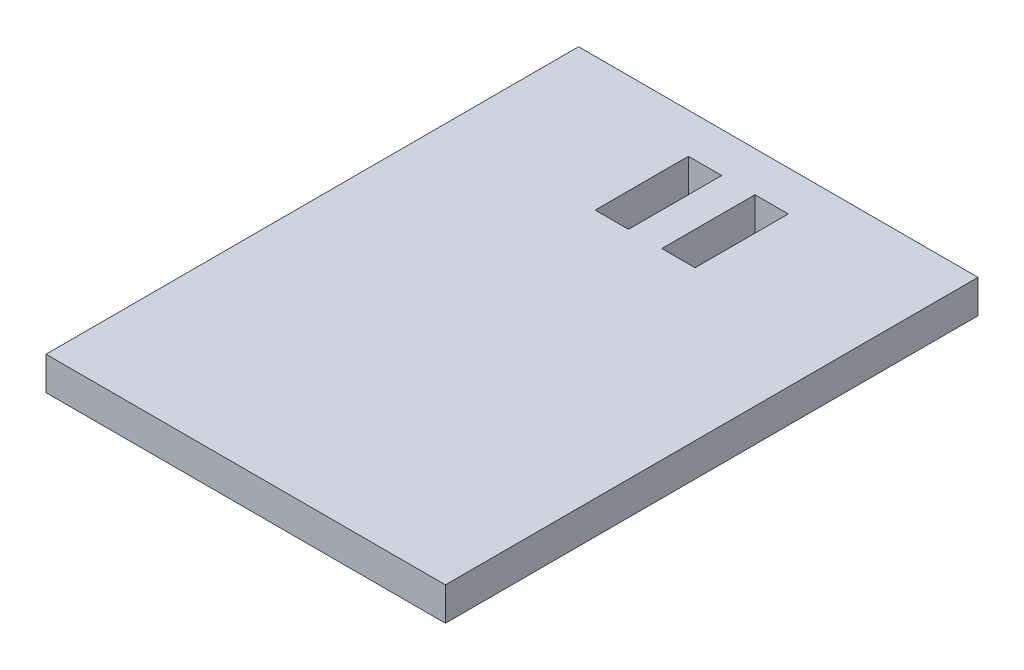
ISO-10303-21;
HEADER;
FILE_DESCRIPTION(('STEP AP214'),'2;1');
FILE_NAME('part.step','',(''),(''),'','','');
FILE_SCHEMA(('AUTOMOTIVE_DESIGN { 1 0 10303 214 1 1 1 1 }'));
ENDSEC;
DATA;
#1=APPLICATION_CONTEXT('core data for automotive mechanical design processes');
#2=APPLICATION_PROTOCOL_DEFINITION('international standard','automotive_design',2000,#1);
#3=PRODUCT_CONTEXT('',#1,'mechanical');
#4=PRODUCT('Part','Part','',(#3));
#5=PRODUCT_RELATED_PRODUCT_CATEGORY('part','',(#4));
#6=PRODUCT_DEFINITION_FORMATION('','',#4);
#7=PRODUCT_DEFINITION_CONTEXT('part definition',#1,'design');
#8=PRODUCT_DEFINITION('design','',#6,#7);
#9=PRODUCT_DEFINITION_SHAPE('','',#8);
#10=(LENGTH_UNIT() NAMED_UNIT(*) SI_UNIT(.MILLI.,.METRE.));
#11=(NAMED_UNIT(*) PLANE_ANGLE_UNIT() SI_UNIT($,.RADIAN.));
#12=(NAMED_UNIT(*) SI_UNIT($,.STERADIAN.) SOLID_ANGLE_UNIT());
#13=UNCERTAINTY_MEASURE_WITH_UNIT(LENGTH_MEASURE(1.E-05),#10,'distance_accuracy_value','');
#14=(GEOMETRIC_REPRESENTATION_CONTEXT(3) GLOBAL_UNCERTAINTY_ASSIGNED_CONTEXT((#13)) GLOBAL_UNIT_ASSIGNED_CONTEXT((#10,
#11,#12)) REPRESENTATION_CONTEXT('',''));
#15=CARTESIAN_POINT('',(0.,0.,0.));
#16=DIRECTION('',(0.,0.,1.));
#17=DIRECTION('',(1.,0.,0.));
#18=AXIS2_PLACEMENT_3D('',#15,#16,#17);
#19=CARTESIAN_POINT('',(0.,3.175,0.));
#20=DIRECTION('',(0.,-1.,0.));
#21=DIRECTION('',(0.,0.,-1.));
#22=AXIS2_PLACEMENT_3D('',#19,#20,#21);
#23=PLANE('',#22);
#24=DIRECTION('',(0.,0.,1.));
#25=VECTOR('',#24,1.);
#26=CARTESIAN_POINT('',(14.2875,3.175,-46.99));
#27=LINE('',#26,#25);
#28=CARTESIAN_POINT('',(14.2875,3.175,-46.99));
#29=VERTEX_POINT('',#28);
#30=CARTESIAN_POINT('',(14.2875,3.175,-38.1));
#31=VERTEX_POINT('',#30);
#32=EDGE_CURVE('E164',#29,#31,#27,.T.);
#33=ORIENTED_EDGE('',*,*,#32,.F.);
#34=DIRECTION('',(-1.,0.,0.));
#35=VECTOR('',#34,1.);
#36=CARTESIAN_POINT('',(14.2875,3.175,-46.99));
#37=LINE('',#36,#35);
#38=CARTESIAN_POINT('',(17.4625,3.175,-46.99));
#39=VERTEX_POINT('',#38);
#40=EDGE_CURVE('E172',#39,#29,#37,.T.);
#41=ORIENTED_EDGE('',*,*,#40,.F.);
#42=DIRECTION('',(0.,0.,-1.));
#43=VECTOR('',#42,1.);
#44=CARTESIAN_POINT('',(17.4625,3.175,-46.99));
#45=LINE('',#44,#43);
#46=CARTESIAN_POINT('',(17.4625,3.175,-38.1));
#47=VERTEX_POINT('',#46);
#48=EDGE_CURVE('E169',#47,#39,#45,.T.);
#49=ORIENTED_EDGE('',*,*,#48,.F.);
#50=DIRECTION('',(1.,0.,0.));
#51=VECTOR('',#50,1.);
#52=CARTESIAN_POINT('',(14.2875,3.175,-38.1));
#53=LINE('',#52,#51);
#54=EDGE_CURVE('E166',#31,#47,#53,.T.);
#55=ORIENTED_EDGE('',*,*,#54,.F.);
#56=EDGE_LOOP('',(#33,#41,#49,#55));
#57=FACE_BOUND('',#56,.T.);
#58=DIRECTION('',(0.,0.,1.));
#59=VECTOR('',#58,1.);
#60=CARTESIAN_POINT('',(0.,3.175,0.));
#61=LINE('',#60,#59);
#62=CARTESIAN_POINT('',(0.,3.175,-50.8));
#63=VERTEX_POINT('',#62);
#64=CARTESIAN_POINT('',(0.,3.175,0.));
#65=VERTEX_POINT('',#64);
#66=EDGE_CURVE('E195',#63,#65,#61,.T.);
#67=ORIENTED_EDGE('',*,*,#66,.T.);
#68=DIRECTION('',(1.,0.,0.));
#69=VECTOR('',#68,1.);
#70=CARTESIAN_POINT('',(0.,3.175,0.));
#71=LINE('',#70,#69);
#72=CARTESIAN_POINT('',(38.1,3.175,0.));
#73=VERTEX_POINT('',#72);
#74=EDGE_CURVE('E198',#65,#73,#71,.T.);
#75=ORIENTED_EDGE('',*,*,#74,.T.);
#76=DIRECTION('',(0.,0.,-1.));
#77=VECTOR('',#76,1.);
#78=CARTESIAN_POINT('',(38.1,3.175,0.));
#79=LINE('',#78,#77);
#80=CARTESIAN_POINT('',(38.1,3.175,-50.8));
#81=VERTEX_POINT('',#80);
#82=EDGE_CURVE('E201',#73,#81,#79,.T.);
#83=ORIENTED_EDGE('',*,*,#82,.T.);
#84=DIRECTION('',(-1.,0.,0.));
#85=VECTOR('',#84,1.);
#86=CARTESIAN_POINT('',(0.,3.175,-50.8));
#87=LINE('',#86,#85);
#88=EDGE_CURVE('E203',#81,#63,#87,.T.);
#89=ORIENTED_EDGE('',*,*,#88,.T.);
#90=EDGE_LOOP('',(#67,#75,#83,#89));
#91=FACE_BOUND('',#90,.T.);
#92=DIRECTION('',(0.,0.,1.));
#93=VECTOR('',#92,1.);
#94=CARTESIAN_POINT('',(20.6375,3.175,-46.99));
#95=LINE('',#94,#93);
#96=CARTESIAN_POINT('',(20.6375,3.175,-46.99));
#97=VERTEX_POINT('',#96);
#98=CARTESIAN_POINT('',(20.6375,3.175,-38.1));
#99=VERTEX_POINT('',#98);
#100=EDGE_CURVE('E128',#97,#99,#95,.T.);
#101=ORIENTED_EDGE('',*,*,#100,.F.);
#102=DIRECTION('',(-1.,0.,0.));
#103=VECTOR('',#102,1.);
#104=CARTESIAN_POINT('',(20.6375,3.175,-46.99));
#105=LINE('',#104,#103);
#106=CARTESIAN_POINT('',(23.8125,3.175,-46.99));
#107=VERTEX_POINT('',#106);
#108=EDGE_CURVE('E150',#107,#97,#105,.T.);
#109=ORIENTED_EDGE('',*,*,#108,.F.);
#110=DIRECTION('',(0.,0.,-1.));
#111=VECTOR('',#110,1.);
#112=CARTESIAN_POINT('',(23.8125,3.175,-46.99));
#113=LINE('',#112,#111);
#114=CARTESIAN_POINT('',(23.8125,3.175,-38.1));
#115=VERTEX_POINT('',#114);
#116=EDGE_CURVE('E148',#115,#107,#113,.T.);
#117=ORIENTED_EDGE('',*,*,#116,.F.);
#118=DIRECTION('',(1.,0.,0.));
#119=VECTOR('',#118,1.);
#120=CARTESIAN_POINT('',(20.6375,3.175,-38.1));
#121=LINE('',#120,#119);
#122=EDGE_CURVE('E136',#99,#115,#121,.T.);
#123=ORIENTED_EDGE('',*,*,#122,.F.);
#124=EDGE_LOOP('',(#101,#109,#117,#123));
#125=FACE_BOUND('',#124,.T.);
#126=ADVANCED_FACE('F39',(#57,#91,#125),#23,.F.);
#127=CARTESIAN_POINT('',(0.,0.,0.));
#128=DIRECTION('',(0.,-1.,0.));
#129=DIRECTION('',(0.,0.,-1.));
#130=AXIS2_PLACEMENT_3D('',#127,#128,#129);
#131=PLANE('',#130);
#132=DIRECTION('',(0.,0.,1.));
#133=VECTOR('',#132,1.);
#134=CARTESIAN_POINT('',(0.,0.,0.));
#135=LINE('',#134,#133);
#136=CARTESIAN_POINT('',(0.,0.,-50.8));
#137=VERTEX_POINT('',#136);
#138=CARTESIAN_POINT('',(0.,0.,0.));
#139=VERTEX_POINT('',#138);
#140=EDGE_CURVE('E194',#137,#139,#135,.T.);
#141=ORIENTED_EDGE('',*,*,#140,.F.);
#142=DIRECTION('',(-1.,0.,0.));
#143=VECTOR('',#142,1.);
#144=CARTESIAN_POINT('',(0.,0.,-50.8));
#145=LINE('',#144,#143);
#146=CARTESIAN_POINT('',(38.1,0.,-50.8));
#147=VERTEX_POINT('',#146);
#148=EDGE_CURVE('E199',#147,#137,#145,.T.);
#149=ORIENTED_EDGE('',*,*,#148,.F.);
#150=DIRECTION('',(0.,0.,-1.));
#151=VECTOR('',#150,1.);
#152=CARTESIAN_POINT('',(38.1,0.,0.));
#153=LINE('',#152,#151);
#154=CARTESIAN_POINT('',(38.1,0.,0.));
#155=VERTEX_POINT('',#154);
#156=EDGE_CURVE('E210',#155,#147,#153,.T.);
#157=ORIENTED_EDGE('',*,*,#156,.F.);
#158=DIRECTION('',(1.,0.,0.));
#159=VECTOR('',#158,1.);
#160=CARTESIAN_POINT('',(0.,0.,0.));
#161=LINE('',#160,#159);
#162=EDGE_CURVE('E208',#139,#155,#161,.T.);
#163=ORIENTED_EDGE('',*,*,#162,.F.);
#164=EDGE_LOOP('',(#141,#149,#157,#163));
#165=FACE_BOUND('',#164,.T.);
#166=DIRECTION('',(-1.,0.,0.));
#167=VECTOR('',#166,1.);
#168=CARTESIAN_POINT('',(14.2875,0.,-46.99));
#169=LINE('',#168,#167);
#170=CARTESIAN_POINT('',(17.4625,0.,-46.99));
#171=VERTEX_POINT('',#170);
#172=CARTESIAN_POINT('',(14.2875,0.,-46.99));
#173=VERTEX_POINT('',#172);
#174=EDGE_CURVE('E167',#171,#173,#169,.T.);
#175=ORIENTED_EDGE('',*,*,#174,.T.);
#176=DIRECTION('',(0.,0.,1.));
#177=VECTOR('',#176,1.);
#178=CARTESIAN_POINT('',(14.2875,0.,-46.99));
#179=LINE('',#178,#177);
#180=CARTESIAN_POINT('',(14.2875,0.,-38.1));
#181=VERTEX_POINT('',#180);
#182=EDGE_CURVE('E144',#173,#181,#179,.T.);
#183=ORIENTED_EDGE('',*,*,#182,.T.);
#184=DIRECTION('',(1.,0.,0.));
#185=VECTOR('',#184,1.);
#186=CARTESIAN_POINT('',(14.2875,0.,-38.1));
#187=LINE('',#186,#185);
#188=CARTESIAN_POINT('',(17.4625,0.,-38.1));
#189=VERTEX_POINT('',#188);
#190=EDGE_CURVE('E177',#181,#189,#187,.T.);
#191=ORIENTED_EDGE('',*,*,#190,.T.);
#192=DIRECTION('',(0.,0.,-1.));
#193=VECTOR('',#192,1.);
#194=CARTESIAN_POINT('',(17.4625,0.,-46.99));
#195=LINE('',#194,#193);
#196=EDGE_CURVE('E180',#189,#171,#195,.T.);
#197=ORIENTED_EDGE('',*,*,#196,.T.);
#198=EDGE_LOOP('',(#175,#183,#191,#197));
#199=FACE_BOUND('',#198,.T.);
#200=DIRECTION('',(-1.,0.,0.));
#201=VECTOR('',#200,1.);
#202=CARTESIAN_POINT('',(20.6375,0.,-46.99));
#203=LINE('',#202,#201);
#204=CARTESIAN_POINT('',(23.8125,0.,-46.99));
#205=VERTEX_POINT('',#204);
#206=CARTESIAN_POINT('',(20.6375,0.,-46.99));
#207=VERTEX_POINT('',#206);
#208=EDGE_CURVE('E137',#205,#207,#203,.T.);
#209=ORIENTED_EDGE('',*,*,#208,.T.);
#210=DIRECTION('',(0.,0.,1.));
#211=VECTOR('',#210,1.);
#212=CARTESIAN_POINT('',(20.6375,0.,-46.99));
#213=LINE('',#212,#211);
#214=CARTESIAN_POINT('',(20.6375,0.,-38.1));
#215=VERTEX_POINT('',#214);
#216=EDGE_CURVE('E62',#207,#215,#213,.T.);
#217=ORIENTED_EDGE('',*,*,#216,.T.);
#218=DIRECTION('',(1.,0.,0.));
#219=VECTOR('',#218,1.);
#220=CARTESIAN_POINT('',(20.6375,0.,-38.1));
#221=LINE('',#220,#219);
#222=CARTESIAN_POINT('',(23.8125,0.,-38.1));
#223=VERTEX_POINT('',#222);
#224=EDGE_CURVE('E143',#215,#223,#221,.T.);
#225=ORIENTED_EDGE('',*,*,#224,.T.);
#226=DIRECTION('',(0.,0.,-1.));
#227=VECTOR('',#226,1.);
#228=CARTESIAN_POINT('',(23.8125,0.,-46.99));
#229=LINE('',#228,#227);
#230=EDGE_CURVE('E156',#223,#205,#229,.T.);
#231=ORIENTED_EDGE('',*,*,#230,.T.);
#232=EDGE_LOOP('',(#209,#217,#225,#231));
#233=FACE_BOUND('',#232,.T.);
#234=ADVANCED_FACE('F228',(#165,#199,#233),#131,.T.);
#235=CARTESIAN_POINT('',(0.,3.175,0.));
#236=DIRECTION('',(1.,0.,0.));
#237=DIRECTION('',(0.,0.,-1.));
#238=AXIS2_PLACEMENT_3D('',#235,#236,#237);
#239=PLANE('',#238);
#240=ORIENTED_EDGE('',*,*,#140,.T.);
#241=DIRECTION('',(0.,-1.,0.));
#242=VECTOR('',#241,1.);
#243=CARTESIAN_POINT('',(0.,3.175,0.));
#244=LINE('',#243,#242);
#245=EDGE_CURVE('E11',#65,#139,#244,.T.);
#246=ORIENTED_EDGE('',*,*,#245,.F.);
#247=ORIENTED_EDGE('',*,*,#66,.F.);
#248=DIRECTION('',(0.,-1.,0.));
#249=VECTOR('',#248,1.);
#250=CARTESIAN_POINT('',(0.,3.175,-50.8));
#251=LINE('',#250,#249);
#252=EDGE_CURVE('E205',#63,#137,#251,.T.);
#253=ORIENTED_EDGE('',*,*,#252,.T.);
#254=EDGE_LOOP('',(#240,#246,#247,#253));
#255=FACE_BOUND('',#254,.T.);
#256=ADVANCED_FACE('F41',(#255),#239,.F.);
#257=CARTESIAN_POINT('',(0.,3.175,0.));
#258=DIRECTION('',(0.,0.,-1.));
#259=DIRECTION('',(-1.,0.,0.));
#260=AXIS2_PLACEMENT_3D('',#257,#258,#259);
#261=PLANE('',#260);
#262=ORIENTED_EDGE('',*,*,#162,.T.);
#263=DIRECTION('',(0.,-1.,0.));
#264=VECTOR('',#263,1.);
#265=CARTESIAN_POINT('',(38.1,3.175,0.));
#266=LINE('',#265,#264);
#267=EDGE_CURVE('E47',#73,#155,#266,.T.);
#268=ORIENTED_EDGE('',*,*,#267,.F.);
#269=ORIENTED_EDGE('',*,*,#74,.F.);
#270=ORIENTED_EDGE('',*,*,#245,.T.);
#271=EDGE_LOOP('',(#262,#268,#269,#270));
#272=FACE_BOUND('',#271,.T.);
#273=ADVANCED_FACE('F238',(#272),#261,.F.);
#274=CARTESIAN_POINT('',(38.1,3.175,0.));
#275=DIRECTION('',(-1.,0.,0.));
#276=DIRECTION('',(0.,0.,1.));
#277=AXIS2_PLACEMENT_3D('',#274,#275,#276);
#278=PLANE('',#277);
#279=ORIENTED_EDGE('',*,*,#156,.T.);
#280=DIRECTION('',(0.,-1.,0.));
#281=VECTOR('',#280,1.);
#282=CARTESIAN_POINT('',(38.1,3.175,-50.8));
#283=LINE('',#282,#281);
#284=EDGE_CURVE('E215',#81,#147,#283,.T.);
#285=ORIENTED_EDGE('',*,*,#284,.F.);
#286=ORIENTED_EDGE('',*,*,#82,.F.);
#287=ORIENTED_EDGE('',*,*,#267,.T.);
#288=EDGE_LOOP('',(#279,#285,#286,#287));
#289=FACE_BOUND('',#288,.T.);
#290=ADVANCED_FACE('F222',(#289),#278,.F.);
#291=CARTESIAN_POINT('',(0.,3.175,-50.8));
#292=DIRECTION('',(0.,0.,1.));
#293=DIRECTION('',(1.,0.,0.));
#294=AXIS2_PLACEMENT_3D('',#291,#292,#293);
#295=PLANE('',#294);
#296=ORIENTED_EDGE('',*,*,#148,.T.);
#297=ORIENTED_EDGE('',*,*,#252,.F.);
#298=ORIENTED_EDGE('',*,*,#88,.F.);
#299=ORIENTED_EDGE('',*,*,#284,.T.);
#300=EDGE_LOOP('',(#296,#297,#298,#299));
#301=FACE_BOUND('',#300,.T.);
#302=ADVANCED_FACE('F232',(#301),#295,.F.);
#303=CARTESIAN_POINT('',(14.2875,3.175,-46.99));
#304=DIRECTION('',(1.,0.,0.));
#305=DIRECTION('',(0.,0.,-1.));
#306=AXIS2_PLACEMENT_3D('',#303,#304,#305);
#307=PLANE('',#306);
#308=ORIENTED_EDGE('',*,*,#182,.F.);
#309=DIRECTION('',(0.,-1.,0.));
#310=VECTOR('',#309,1.);
#311=CARTESIAN_POINT('',(14.2875,3.175,-46.99));
#312=LINE('',#311,#310);
#313=EDGE_CURVE('E174',#29,#173,#312,.T.);
#314=ORIENTED_EDGE('',*,*,#313,.F.);
#315=ORIENTED_EDGE('',*,*,#32,.T.);
#316=DIRECTION('',(0.,-1.,0.));
#317=VECTOR('',#316,1.);
#318=CARTESIAN_POINT('',(14.2875,3.175,-38.1));
#319=LINE('',#318,#317);
#320=EDGE_CURVE('E191',#31,#181,#319,.T.);
#321=ORIENTED_EDGE('',*,*,#320,.T.);
#322=EDGE_LOOP('',(#308,#314,#315,#321));
#323=FACE_BOUND('',#322,.T.);
#324=ADVANCED_FACE('F254',(#323),#307,.T.);
#325=CARTESIAN_POINT('',(14.2875,3.175,-38.1));
#326=DIRECTION('',(0.,0.,-1.));
#327=DIRECTION('',(-1.,0.,0.));
#328=AXIS2_PLACEMENT_3D('',#325,#326,#327);
#329=PLANE('',#328);
#330=ORIENTED_EDGE('',*,*,#190,.F.);
#331=ORIENTED_EDGE('',*,*,#320,.F.);
#332=ORIENTED_EDGE('',*,*,#54,.T.);
#333=DIRECTION('',(0.,-1.,0.));
#334=VECTOR('',#333,1.);
#335=CARTESIAN_POINT('',(17.4625,3.175,-38.1));
#336=LINE('',#335,#334);
#337=EDGE_CURVE('E189',#47,#189,#336,.T.);
#338=ORIENTED_EDGE('',*,*,#337,.T.);
#339=EDGE_LOOP('',(#330,#331,#332,#338));
#340=FACE_BOUND('',#339,.T.);
#341=ADVANCED_FACE('F261',(#340),#329,.T.);
#342=CARTESIAN_POINT('',(17.4625,3.175,-46.99));
#343=DIRECTION('',(-1.,0.,0.));
#344=DIRECTION('',(0.,0.,1.));
#345=AXIS2_PLACEMENT_3D('',#342,#343,#344);
#346=PLANE('',#345);
#347=ORIENTED_EDGE('',*,*,#196,.F.);
#348=ORIENTED_EDGE('',*,*,#337,.F.);
#349=ORIENTED_EDGE('',*,*,#48,.T.);
#350=DIRECTION('',(0.,-1.,0.));
#351=VECTOR('',#350,1.);
#352=CARTESIAN_POINT('',(17.4625,3.175,-46.99));
#353=LINE('',#352,#351);
#354=EDGE_CURVE('E187',#39,#171,#353,.T.);
#355=ORIENTED_EDGE('',*,*,#354,.T.);
#356=EDGE_LOOP('',(#347,#348,#349,#355));
#357=FACE_BOUND('',#356,.T.);
#358=ADVANCED_FACE('F266',(#357),#346,.T.);
#359=CARTESIAN_POINT('',(14.2875,3.175,-46.99));
#360=DIRECTION('',(0.,0.,1.));
#361=DIRECTION('',(1.,0.,0.));
#362=AXIS2_PLACEMENT_3D('',#359,#360,#361);
#363=PLANE('',#362);
#364=ORIENTED_EDGE('',*,*,#174,.F.);
#365=ORIENTED_EDGE('',*,*,#354,.F.);
#366=ORIENTED_EDGE('',*,*,#40,.T.);
#367=ORIENTED_EDGE('',*,*,#313,.T.);
#368=EDGE_LOOP('',(#364,#365,#366,#367));
#369=FACE_BOUND('',#368,.T.);
#370=ADVANCED_FACE('F272',(#369),#363,.T.);
#371=CARTESIAN_POINT('',(20.6375,3.175,-46.99));
#372=DIRECTION('',(1.,0.,0.));
#373=DIRECTION('',(0.,0.,-1.));
#374=AXIS2_PLACEMENT_3D('',#371,#372,#373);
#375=PLANE('',#374);
#376=ORIENTED_EDGE('',*,*,#216,.F.);
#377=DIRECTION('',(0.,-1.,0.));
#378=VECTOR('',#377,1.);
#379=CARTESIAN_POINT('',(20.6375,3.175,-46.99));
#380=LINE('',#379,#378);
#381=EDGE_CURVE('E132',#97,#207,#380,.T.);
#382=ORIENTED_EDGE('',*,*,#381,.F.);
#383=ORIENTED_EDGE('',*,*,#100,.T.);
#384=DIRECTION('',(0.,-1.,0.));
#385=VECTOR('',#384,1.);
#386=CARTESIAN_POINT('',(20.6375,3.175,-38.1));
#387=LINE('',#386,#385);
#388=EDGE_CURVE('E131',#99,#215,#387,.T.);
#389=ORIENTED_EDGE('',*,*,#388,.T.);
#390=EDGE_LOOP('',(#376,#382,#383,#389));
#391=FACE_BOUND('',#390,.T.);
#392=ADVANCED_FACE('F130',(#391),#375,.T.);
#393=CARTESIAN_POINT('',(20.6375,3.175,-38.1));
#394=DIRECTION('',(0.,0.,-1.));
#395=DIRECTION('',(-1.,0.,0.));
#396=AXIS2_PLACEMENT_3D('',#393,#394,#395);
#397=PLANE('',#396);
#398=ORIENTED_EDGE('',*,*,#224,.F.);
#399=ORIENTED_EDGE('',*,*,#388,.F.);
#400=ORIENTED_EDGE('',*,*,#122,.T.);
#401=DIRECTION('',(0.,-1.,0.));
#402=VECTOR('',#401,1.);
#403=CARTESIAN_POINT('',(23.8125,3.175,-38.1));
#404=LINE('',#403,#402);
#405=EDGE_CURVE('E145',#115,#223,#404,.T.);
#406=ORIENTED_EDGE('',*,*,#405,.T.);
#407=EDGE_LOOP('',(#398,#399,#400,#406));
#408=FACE_BOUND('',#407,.T.);
#409=ADVANCED_FACE('F140',(#408),#397,.T.);
#410=CARTESIAN_POINT('',(23.8125,3.175,-46.99));
#411=DIRECTION('',(-1.,0.,0.));
#412=DIRECTION('',(0.,0.,1.));
#413=AXIS2_PLACEMENT_3D('',#410,#411,#412);
#414=PLANE('',#413);
#415=ORIENTED_EDGE('',*,*,#230,.F.);
#416=ORIENTED_EDGE('',*,*,#405,.F.);
#417=ORIENTED_EDGE('',*,*,#116,.T.);
#418=DIRECTION('',(0.,-1.,0.));
#419=VECTOR('',#418,1.);
#420=CARTESIAN_POINT('',(23.8125,3.175,-46.99));
#421=LINE('',#420,#419);
#422=EDGE_CURVE('E54',#107,#205,#421,.T.);
#423=ORIENTED_EDGE('',*,*,#422,.T.);
#424=EDGE_LOOP('',(#415,#416,#417,#423));
#425=FACE_BOUND('',#424,.T.);
#426=ADVANCED_FACE('F291',(#425),#414,.T.);
#427=CARTESIAN_POINT('',(20.6375,3.175,-46.99));
#428=DIRECTION('',(0.,0.,1.));
#429=DIRECTION('',(1.,0.,0.));
#430=AXIS2_PLACEMENT_3D('',#427,#428,#429);
#431=PLANE('',#430);
#432=ORIENTED_EDGE('',*,*,#208,.F.);
#433=ORIENTED_EDGE('',*,*,#422,.F.);
#434=ORIENTED_EDGE('',*,*,#108,.T.);
#435=ORIENTED_EDGE('',*,*,#381,.T.);
#436=EDGE_LOOP('',(#432,#433,#434,#435));
#437=FACE_BOUND('',#436,.T.);
#438=ADVANCED_FACE('F294',(#437),#431,.T.);
#439=CLOSED_SHELL('',(#126,#234,#256,#273,#290,#302,#324,#341,#358,#370,#392,#409,#426,#438));
#440=MANIFOLD_SOLID_BREP('B2',#439);
#441=ADVANCED_BREP_SHAPE_REPRESENTATION('',(#18,#440),#14);
#442=SHAPE_DEFINITION_REPRESENTATION(#9,#441);
ENDSEC;
END-ISO-10303-21;
